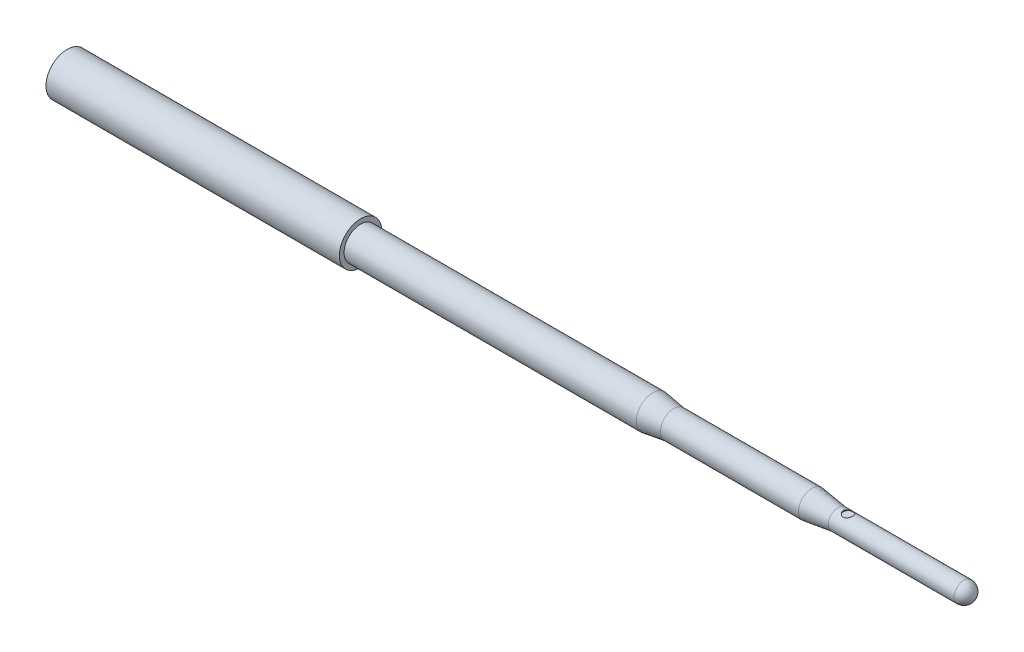
ISO-10303-21;
HEADER;
FILE_DESCRIPTION(('STEP AP214'),'2;1');
FILE_NAME('part.step','',(''),(''),'','','');
FILE_SCHEMA(('AUTOMOTIVE_DESIGN { 1 0 10303 214 1 1 1 1 }'));
ENDSEC;
DATA;
#1=APPLICATION_CONTEXT('core data for automotive mechanical design processes');
#2=APPLICATION_PROTOCOL_DEFINITION('international standard','automotive_design',2000,#1);
#3=PRODUCT_CONTEXT('',#1,'mechanical');
#4=PRODUCT('Part','Part','',(#3));
#5=PRODUCT_RELATED_PRODUCT_CATEGORY('part','',(#4));
#6=PRODUCT_DEFINITION_FORMATION('','',#4);
#7=PRODUCT_DEFINITION_CONTEXT('part definition',#1,'design');
#8=PRODUCT_DEFINITION('design','',#6,#7);
#9=PRODUCT_DEFINITION_SHAPE('','',#8);
#10=(LENGTH_UNIT() NAMED_UNIT(*) SI_UNIT(.MILLI.,.METRE.));
#11=(NAMED_UNIT(*) PLANE_ANGLE_UNIT() SI_UNIT($,.RADIAN.));
#12=(NAMED_UNIT(*) SI_UNIT($,.STERADIAN.) SOLID_ANGLE_UNIT());
#13=UNCERTAINTY_MEASURE_WITH_UNIT(LENGTH_MEASURE(1.E-05),#10,'distance_accuracy_value','');
#14=(GEOMETRIC_REPRESENTATION_CONTEXT(3) GLOBAL_UNCERTAINTY_ASSIGNED_CONTEXT((#13)) GLOBAL_UNIT_ASSIGNED_CONTEXT((#10,
#11,#12)) REPRESENTATION_CONTEXT('',''));
#15=CARTESIAN_POINT('',(0.,0.,0.));
#16=DIRECTION('',(0.,0.,1.));
#17=DIRECTION('',(1.,0.,0.));
#18=AXIS2_PLACEMENT_3D('',#15,#16,#17);
#19=CARTESIAN_POINT('',(53.8000960052301,0.,-20.6902384790194));
#20=DIRECTION('',(1.,0.,0.));
#21=DIRECTION('',(0.,0.,-1.));
#22=AXIS2_PLACEMENT_3D('',#19,#20,#21);
#23=CYLINDRICAL_SURFACE('',#22,2.87019999999999);
#24=CARTESIAN_POINT('',(17.4018960052301,0.,-20.6902384790194));
#25=DIRECTION('',(1.,0.,0.));
#26=DIRECTION('',(0.,0.,-1.));
#27=AXIS2_PLACEMENT_3D('',#24,#25,#26);
#28=CIRCLE('',#27,2.87019999999999);
#29=CARTESIAN_POINT('',(17.4018960052301,0.,-23.5604384790194));
#30=VERTEX_POINT('',#29);
#31=EDGE_CURVE('E129',#30,#30,#28,.T.);
#32=ORIENTED_EDGE('',*,*,#31,.T.);
#33=EDGE_LOOP('',(#32));
#34=FACE_BOUND('',#33,.T.);
#35=CARTESIAN_POINT('',(53.8000960052301,0.,-20.6902384790194));
#36=DIRECTION('',(1.,0.,0.));
#37=DIRECTION('',(0.,0.,-1.));
#38=AXIS2_PLACEMENT_3D('',#35,#36,#37);
#39=CIRCLE('',#38,2.87019999999999);
#40=CARTESIAN_POINT('',(53.8000960052301,0.,-23.5604384790194));
#41=VERTEX_POINT('',#40);
#42=EDGE_CURVE('E77',#41,#41,#39,.F.);
#43=ORIENTED_EDGE('',*,*,#42,.T.);
#44=EDGE_LOOP('',(#43));
#45=FACE_BOUND('',#44,.T.);
#46=CARTESIAN_POINT('',(20.6784960052301,2.54,-22.0268192060988));
#47=CARTESIAN_POINT('',(20.7548770065525,2.55218477007243,-22.0036138192428));
#48=CARTESIAN_POINT('',(20.8286323254648,2.56738457983878,-21.9740228480331));
#49=CARTESIAN_POINT('',(20.9692966108197,2.60152364395321,-21.9033681714022));
#50=CARTESIAN_POINT('',(21.0362205132478,2.62045446307308,-21.8623302603637));
#51=CARTESIAN_POINT('',(21.1618496388752,2.65979829089355,-21.7700621214589));
#52=CARTESIAN_POINT('',(21.2205717730049,2.68020811396908,-21.7188534090241));
#53=CARTESIAN_POINT('',(21.3288690098896,2.72041951704042,-21.6072374260097));
#54=CARTESIAN_POINT('',(21.3784370345354,2.74022061658263,-21.5468231028243));
#55=CARTESIAN_POINT('',(21.4688856089129,2.77794610877653,-21.4154359789208));
#56=CARTESIAN_POINT('',(21.5093428138437,2.79576469812553,-21.34413907523));
#57=CARTESIAN_POINT('',(21.5774131766691,2.82654690472802,-21.1947007051216));
#58=CARTESIAN_POINT('',(21.605036669966,2.83951442705706,-21.1165648068487));
#59=CARTESIAN_POINT('',(21.6446054715832,2.85831100539456,-20.9617749594508));
#60=CARTESIAN_POINT('',(21.6575526810937,2.8645941370437,-20.8854331503863));
#61=CARTESIAN_POINT('',(21.6706229661784,2.87093731638563,-20.7314145277385));
#62=CARTESIAN_POINT('',(21.6707521587523,2.87100033243495,-20.6537383686338));
#63=CARTESIAN_POINT('',(21.6586946158928,2.86514813843538,-20.5057690127702));
#64=CARTESIAN_POINT('',(21.6474746587357,2.85970220653752,-20.4353752166275));
#65=CARTESIAN_POINT('',(21.6146574932907,2.84406451148937,-20.2976163075753));
#66=CARTESIAN_POINT('',(21.5930599877061,2.83387261237653,-20.2302512814947));
#67=CARTESIAN_POINT('',(21.5397452493912,2.80941316943068,-20.0987886481372));
#68=CARTESIAN_POINT('',(21.5078268394738,2.79506524941092,-20.0347881682557));
#69=CARTESIAN_POINT('',(21.4349891097649,2.76363540462965,-19.9128457391303));
#70=CARTESIAN_POINT('',(21.3940634416865,2.74655155391737,-19.8549081056685));
#71=CARTESIAN_POINT('',(21.2999878542148,2.7094209680611,-19.741028436377));
#72=CARTESIAN_POINT('',(21.2460543118945,2.68924647752652,-19.6857751297477));
#73=CARTESIAN_POINT('',(21.129784384459,2.64935687318623,-19.584842490857));
#74=CARTESIAN_POINT('',(21.0674549178903,2.62964139666106,-19.539155354079));
#75=CARTESIAN_POINT('',(20.9514311211835,2.59723539807891,-19.468125474013));
#76=CARTESIAN_POINT('',(20.8992603304574,2.58399516326944,-19.4405320900811));
#77=CARTESIAN_POINT('',(20.7913741445713,2.55994170168752,-19.3919837849812));
#78=CARTESIAN_POINT('',(20.7356573611244,2.54912943308045,-19.3710314832928));
#79=CARTESIAN_POINT('',(20.6784960052301,2.54,-19.3536577519401));
#80=B_SPLINE_CURVE_WITH_KNOTS('',3,(#46,#47,#48,#49,#50,#51,#52,#53,#54,#55,#56,#57,#58,#59,#60,
#61,#62,#63,#64,#65,#66,#67,#68,#69,#70,#71,#72,#73,#74,#75,#76,#77,#78,#79),.UNSPECIFIED.,.F.,
.F.,(4,2,2,2,2,2,2,2,2,2,2,2,2,2,2,2,4),(0.,0.24164368782511,0.482747197725414,
0.723346004942827,0.964130075292331,1.21447953634247,1.46462703190889,1.69641487119524,
1.92809209641607,2.14156807472835,2.35505016908071,2.57297340422167,2.7910507256401,
3.02944397731902,3.26764197252269,3.44860764459085,3.62964460739547),.UNSPECIFIED.);
#81=CARTESIAN_POINT('',(20.6784960052301,2.54,-22.0268192060988));
#82=VERTEX_POINT('',#81);
#83=CARTESIAN_POINT('',(20.6784960052301,2.54,-19.3536577519401));
#84=VERTEX_POINT('',#83);
#85=EDGE_CURVE('E71',#82,#84,#80,.T.);
#86=ORIENTED_EDGE('',*,*,#85,.T.);
#87=DIRECTION('',(1.,0.,0.));
#88=VECTOR('',#87,1.);
#89=CARTESIAN_POINT('',(53.8000960052301,2.54,-19.3536577519401));
#90=LINE('',#89,#88);
#91=CARTESIAN_POINT('',(19.86569600523,2.54,-19.3536577519401));
#92=VERTEX_POINT('',#91);
#93=EDGE_CURVE('E11',#84,#92,#90,.F.);
#94=ORIENTED_EDGE('',*,*,#93,.T.);
#95=CARTESIAN_POINT('',(19.86569600523,2.54,-19.3536577519401));
#96=CARTESIAN_POINT('',(19.7893150039076,2.55218477007243,-19.376863138796));
#97=CARTESIAN_POINT('',(19.7155596849953,2.56738457983878,-19.4064541100058));
#98=CARTESIAN_POINT('',(19.5748953996405,2.60152364395321,-19.4771087866367));
#99=CARTESIAN_POINT('',(19.5079714972123,2.62045446307308,-19.5181466976752));
#100=CARTESIAN_POINT('',(19.3823423715849,2.65979829089355,-19.6104148365799));
#101=CARTESIAN_POINT('',(19.3236202374553,2.68020811396908,-19.6616235490148));
#102=CARTESIAN_POINT('',(19.2153230005706,2.72041951704042,-19.7732395320292));
#103=CARTESIAN_POINT('',(19.1657549759247,2.74022061658263,-19.8336538552146));
#104=CARTESIAN_POINT('',(19.0753064015472,2.77794610877653,-19.9650409791181));
#105=CARTESIAN_POINT('',(19.0348491966164,2.79576469812554,-20.0363378828089));
#106=CARTESIAN_POINT('',(18.966778833791,2.82654690472803,-20.1857762529173));
#107=CARTESIAN_POINT('',(18.9391553404941,2.83951442705706,-20.2639121511902));
#108=CARTESIAN_POINT('',(18.8995865388769,2.85831100539456,-20.4187019985881));
#109=CARTESIAN_POINT('',(18.8866393293664,2.8645941370437,-20.4950438076526));
#110=CARTESIAN_POINT('',(18.8735690442817,2.87093731638563,-20.6490624303004));
#111=CARTESIAN_POINT('',(18.8734398517078,2.87100033243495,-20.7267385894051));
#112=CARTESIAN_POINT('',(18.8854973945674,2.86514813843538,-20.8747079452687));
#113=CARTESIAN_POINT('',(18.8967173517245,2.85970220653751,-20.9451017414114));
#114=CARTESIAN_POINT('',(18.9295345171695,2.84406451148937,-21.0828606504636));
#115=CARTESIAN_POINT('',(18.9511320227541,2.83387261237653,-21.1502256765441));
#116=CARTESIAN_POINT('',(19.004446761069,2.80941316943067,-21.2816883099017));
#117=CARTESIAN_POINT('',(19.0363651709863,2.79506524941092,-21.3456887897831));
#118=CARTESIAN_POINT('',(19.1092029006952,2.76363540462964,-21.4676312189086));
#119=CARTESIAN_POINT('',(19.1501285687737,2.74655155391737,-21.5255688523703));
#120=CARTESIAN_POINT('',(19.2442041562454,2.70942096806109,-21.6394485216619));
#121=CARTESIAN_POINT('',(19.2981376985657,2.68924647752651,-21.6947018282912));
#122=CARTESIAN_POINT('',(19.4144076260012,2.64935687318622,-21.7956344671819));
#123=CARTESIAN_POINT('',(19.4767370925699,2.62964139666105,-21.8413216039599));
#124=CARTESIAN_POINT('',(19.5927608892767,2.5972353980789,-21.9123514840259));
#125=CARTESIAN_POINT('',(19.6449316800028,2.58399516326943,-21.9399448679578));
#126=CARTESIAN_POINT('',(19.7528178658889,2.55994170168752,-21.9884931730576));
#127=CARTESIAN_POINT('',(19.8085346493357,2.54912943308045,-22.0094454747461));
#128=CARTESIAN_POINT('',(19.8656960052301,2.54,-22.0268192060988));
#129=B_SPLINE_CURVE_WITH_KNOTS('',3,(#95,#96,#97,#98,#99,#100,#101,#102,#103,#104,#105,#106,
#107,#108,#109,#110,#111,#112,#113,#114,#115,#116,#117,#118,#119,#120,#121,#122,#123,#124,#125,
#126,#127,#128),.UNSPECIFIED.,.F.,.F.,(4,2,2,2,2,2,2,2,2,2,2,2,2,2,2,2,4),(0.,0.241643687825113,
0.482747197725417,0.723346004942827,0.964130075292332,1.21447953634248,1.4646270319089,
1.69641487119524,1.92809209641607,2.14156807472835,2.35505016908071,2.57297340422167,
2.79105072564011,3.02944397731903,3.2676419725227,3.44860764459085,3.62964460739547),.UNSPECIFIED.);
#130=CARTESIAN_POINT('',(19.86569600523,2.54,-22.0268192060988));
#131=VERTEX_POINT('',#130);
#132=EDGE_CURVE('E47',#92,#131,#129,.T.);
#133=ORIENTED_EDGE('',*,*,#132,.T.);
#134=DIRECTION('',(1.,0.,0.));
#135=VECTOR('',#134,1.);
#136=CARTESIAN_POINT('',(53.8000960052301,2.54,-22.0268192060988));
#137=LINE('',#136,#135);
#138=EDGE_CURVE('E75',#131,#82,#137,.T.);
#139=ORIENTED_EDGE('',*,*,#138,.T.);
#140=EDGE_LOOP('',(#86,#94,#133,#139));
#141=FACE_BOUND('',#140,.T.);
#142=ADVANCED_FACE('F39',(#34,#45,#141),#23,.T.);
#143=CARTESIAN_POINT('',(-120.792855475788,0.,-25.4781384790194));
#144=DIRECTION('',(1.,0.,0.));
#145=DIRECTION('',(0.,0.,-1.));
#146=AXIS2_PLACEMENT_3D('',#143,#144,#145);
#147=PLANE('',#146);
#148=CARTESIAN_POINT('',(-120.792855475788,0.,-20.6902384790194));
#149=DIRECTION('',(1.,0.,0.));
#150=DIRECTION('',(0.,0.,-1.));
#151=AXIS2_PLACEMENT_3D('',#148,#149,#150);
#152=CIRCLE('',#151,6.13409999999999);
#153=CARTESIAN_POINT('',(-120.792855475788,0.,-26.8243384790194));
#154=VERTEX_POINT('',#153);
#155=EDGE_CURVE('E133',#154,#154,#152,.T.);
#156=ORIENTED_EDGE('',*,*,#155,.T.);
#157=EDGE_LOOP('',(#156));
#158=FACE_BOUND('',#157,.T.);
#159=CARTESIAN_POINT('',(-120.792855475788,0.,-20.6902384790194));
#160=DIRECTION('',(1.,0.,0.));
#161=DIRECTION('',(0.,0.,-1.));
#162=AXIS2_PLACEMENT_3D('',#159,#160,#161);
#163=CIRCLE('',#162,4.78789999999999);
#164=CARTESIAN_POINT('',(-120.792855475788,0.,-25.4781384790194));
#165=VERTEX_POINT('',#164);
#166=EDGE_CURVE('E73',#165,#165,#163,.T.);
#167=ORIENTED_EDGE('',*,*,#166,.F.);
#168=EDGE_LOOP('',(#167));
#169=FACE_BOUND('',#168,.T.);
#170=ADVANCED_FACE('F120',(#158,#169),#147,.T.);
#171=CARTESIAN_POINT('',(53.8000960052301,0.,-20.6902384790194));
#172=DIRECTION('',(1.,0.,0.));
#173=DIRECTION('',(0.,0.,-1.));
#174=AXIS2_PLACEMENT_3D('',#171,#172,#173);
#175=CYLINDRICAL_SURFACE('',#174,6.13409999999999);
#176=CARTESIAN_POINT('',(-205.705055475788,0.,-20.6902384790194));
#177=DIRECTION('',(1.,0.,0.));
#178=DIRECTION('',(0.,0.,-1.));
#179=AXIS2_PLACEMENT_3D('',#176,#177,#178);
#180=CIRCLE('',#179,6.13409999999999);
#181=CARTESIAN_POINT('',(-205.705055475788,0.,-26.8243384790194));
#182=VERTEX_POINT('',#181);
#183=EDGE_CURVE('E135',#182,#182,#180,.T.);
#184=ORIENTED_EDGE('',*,*,#183,.T.);
#185=EDGE_LOOP('',(#184));
#186=FACE_BOUND('',#185,.T.);
#187=ORIENTED_EDGE('',*,*,#155,.F.);
#188=EDGE_LOOP('',(#187));
#189=FACE_BOUND('',#188,.T.);
#190=ADVANCED_FACE('F115',(#186,#189),#175,.T.);
#191=CARTESIAN_POINT('',(-205.705055475788,0.,-20.6902384790194));
#192=DIRECTION('',(-1.,0.,0.));
#193=DIRECTION('',(0.,0.,1.));
#194=AXIS2_PLACEMENT_3D('',#191,#192,#193);
#195=PLANE('',#194);
#196=ORIENTED_EDGE('',*,*,#183,.F.);
#197=EDGE_LOOP('',(#196));
#198=FACE_BOUND('',#197,.T.);
#199=ADVANCED_FACE('F110',(#198),#195,.T.);
#200=CARTESIAN_POINT('',(17.4018960052301,0.,-20.6902384790194));
#201=DIRECTION('',(-1.,0.,0.));
#202=DIRECTION('',(0.,0.,1.));
#203=AXIS2_PLACEMENT_3D('',#200,#201,#202);
#204=CONICAL_SURFACE('',#203,2.87019999999999,0.134511218050533);
#205=CARTESIAN_POINT('',(9.80038635582489,0.,-20.6902384790194));
#206=DIRECTION('',(1.,0.,0.));
#207=DIRECTION('',(0.,0.,-1.));
#208=AXIS2_PLACEMENT_3D('',#205,#206,#207);
#209=CIRCLE('',#208,3.89889999999999);
#210=CARTESIAN_POINT('',(9.80038635582489,0.,-24.5891384790194));
#211=VERTEX_POINT('',#210);
#212=EDGE_CURVE('E141',#211,#211,#209,.T.);
#213=ORIENTED_EDGE('',*,*,#212,.T.);
#214=EDGE_LOOP('',(#213));
#215=FACE_BOUND('',#214,.T.);
#216=ORIENTED_EDGE('',*,*,#31,.F.);
#217=EDGE_LOOP('',(#216));
#218=FACE_BOUND('',#217,.T.);
#219=ADVANCED_FACE('F107',(#215,#218),#204,.T.);
#220=CARTESIAN_POINT('',(53.8000960052301,0.,-20.6902384790194));
#221=DIRECTION('',(1.,0.,0.));
#222=DIRECTION('',(0.,0.,-1.));
#223=AXIS2_PLACEMENT_3D('',#220,#221,#222);
#224=CYLINDRICAL_SURFACE('',#223,3.89889999999999);
#225=CARTESIAN_POINT('',(-30.1538136441751,0.,-20.6902384790194));
#226=DIRECTION('',(1.,0.,0.));
#227=DIRECTION('',(0.,0.,-1.));
#228=AXIS2_PLACEMENT_3D('',#225,#226,#227);
#229=CIRCLE('',#228,3.89889999999999);
#230=CARTESIAN_POINT('',(-30.1538136441751,0.,-24.5891384790194));
#231=VERTEX_POINT('',#230);
#232=EDGE_CURVE('E143',#231,#231,#229,.T.);
#233=ORIENTED_EDGE('',*,*,#232,.T.);
#234=EDGE_LOOP('',(#233));
#235=FACE_BOUND('',#234,.T.);
#236=ORIENTED_EDGE('',*,*,#212,.F.);
#237=EDGE_LOOP('',(#236));
#238=FACE_BOUND('',#237,.T.);
#239=ADVANCED_FACE('F104',(#235,#238),#224,.T.);
#240=CARTESIAN_POINT('',(-30.1538136441751,0.,-20.6902384790194));
#241=DIRECTION('',(-1.,0.,0.));
#242=DIRECTION('',(0.,0.,1.));
#243=AXIS2_PLACEMENT_3D('',#240,#241,#242);
#244=CONICAL_SURFACE('',#243,3.89889999999999,0.144535634567936);
#245=CARTESIAN_POINT('',(-36.261655475788,0.,-20.6902384790194));
#246=DIRECTION('',(1.,0.,0.));
#247=DIRECTION('',(0.,0.,-1.));
#248=AXIS2_PLACEMENT_3D('',#245,#246,#247);
#249=CIRCLE('',#248,4.78789999999999);
#250=CARTESIAN_POINT('',(-36.261655475788,0.,-25.4781384790194));
#251=VERTEX_POINT('',#250);
#252=EDGE_CURVE('E146',#251,#251,#249,.T.);
#253=ORIENTED_EDGE('',*,*,#252,.T.);
#254=EDGE_LOOP('',(#253));
#255=FACE_BOUND('',#254,.T.);
#256=ORIENTED_EDGE('',*,*,#232,.F.);
#257=EDGE_LOOP('',(#256));
#258=FACE_BOUND('',#257,.T.);
#259=ADVANCED_FACE('F100',(#255,#258),#244,.T.);
#260=CARTESIAN_POINT('',(53.8000960052301,0.,-20.6902384790194));
#261=DIRECTION('',(1.,0.,0.));
#262=DIRECTION('',(0.,0.,-1.));
#263=AXIS2_PLACEMENT_3D('',#260,#261,#262);
#264=CYLINDRICAL_SURFACE('',#263,4.78789999999999);
#265=ORIENTED_EDGE('',*,*,#166,.T.);
#266=EDGE_LOOP('',(#265));
#267=FACE_BOUND('',#266,.T.);
#268=ORIENTED_EDGE('',*,*,#252,.F.);
#269=EDGE_LOOP('',(#268));
#270=FACE_BOUND('',#269,.T.);
#271=ADVANCED_FACE('F96',(#267,#270),#264,.T.);
#272=CARTESIAN_POINT('',(53.8000960052301,0.,-20.6902384790194));
#273=DIRECTION('',(0.,0.,1.));
#274=DIRECTION('',(1.,0.,0.));
#275=AXIS2_PLACEMENT_3D('',#272,#273,#274);
#276=SPHERICAL_SURFACE('',#275,2.8702);
#277=CARTESIAN_POINT('',(53.8000960052301,0.,-20.6902384790194));
#278=DIRECTION('',(1.,0.,0.));
#279=DIRECTION('',(0.,0.,-1.));
#280=AXIS2_PLACEMENT_3D('',#277,#278,#279);
#281=SPHERICAL_SURFACE('',#280,2.8702);
#282=ORIENTED_EDGE('',*,*,#42,.F.);
#283=EDGE_LOOP('',(#282));
#284=FACE_BOUND('',#283,.T.);
#285=ADVANCED_FACE('F41',(#284),#281,.T.);
#286=CARTESIAN_POINT('',(20.2720960052301,5.08,-20.6902384790194));
#287=DIRECTION('',(0.,-1.,0.));
#288=DIRECTION('',(0.,0.,-1.));
#289=AXIS2_PLACEMENT_3D('',#286,#287,#288);
#290=CYLINDRICAL_SURFACE('',#289,1.397);
#291=CARTESIAN_POINT('',(20.2720960052301,2.54,-20.6902384790194));
#292=DIRECTION('',(0.,1.,0.));
#293=DIRECTION('',(0.,0.,1.));
#294=AXIS2_PLACEMENT_3D('',#291,#292,#293);
#295=CIRCLE('',#294,1.397);
#296=EDGE_CURVE('E66',#131,#92,#295,.T.);
#297=ORIENTED_EDGE('',*,*,#296,.F.);
#298=ORIENTED_EDGE('',*,*,#132,.F.);
#299=EDGE_LOOP('',(#297,#298));
#300=FACE_BOUND('',#299,.T.);
#301=ADVANCED_FACE('F95',(#300),#290,.F.);
#302=EDGE_CURVE('E54',#84,#82,#295,.T.);
#303=ORIENTED_EDGE('',*,*,#302,.F.);
#304=ORIENTED_EDGE('',*,*,#85,.F.);
#305=EDGE_LOOP('',(#303,#304));
#306=FACE_BOUND('',#305,.T.);
#307=ADVANCED_FACE('F70',(#306),#290,.F.);
#308=CARTESIAN_POINT('',(20.2720960052301,2.54,-20.6902384790194));
#309=DIRECTION('',(0.,1.,0.));
#310=DIRECTION('',(0.,0.,1.));
#311=AXIS2_PLACEMENT_3D('',#308,#309,#310);
#312=PLANE('',#311);
#313=ORIENTED_EDGE('',*,*,#302,.T.);
#314=ORIENTED_EDGE('',*,*,#138,.F.);
#315=ORIENTED_EDGE('',*,*,#296,.T.);
#316=ORIENTED_EDGE('',*,*,#93,.F.);
#317=EDGE_LOOP('',(#313,#314,#315,#316));
#318=FACE_BOUND('',#317,.T.);
#319=ADVANCED_FACE('F65',(#318),#312,.T.);
#320=CLOSED_SHELL('',(#142,#170,#190,#199,#219,#239,#259,#271,#285,#301,#307,#319));
#321=MANIFOLD_SOLID_BREP('B2',#320);
#322=ADVANCED_BREP_SHAPE_REPRESENTATION('',(#18,#321),#14);
#323=SHAPE_DEFINITION_REPRESENTATION(#9,#322);
ENDSEC;
END-ISO-10303-21;
